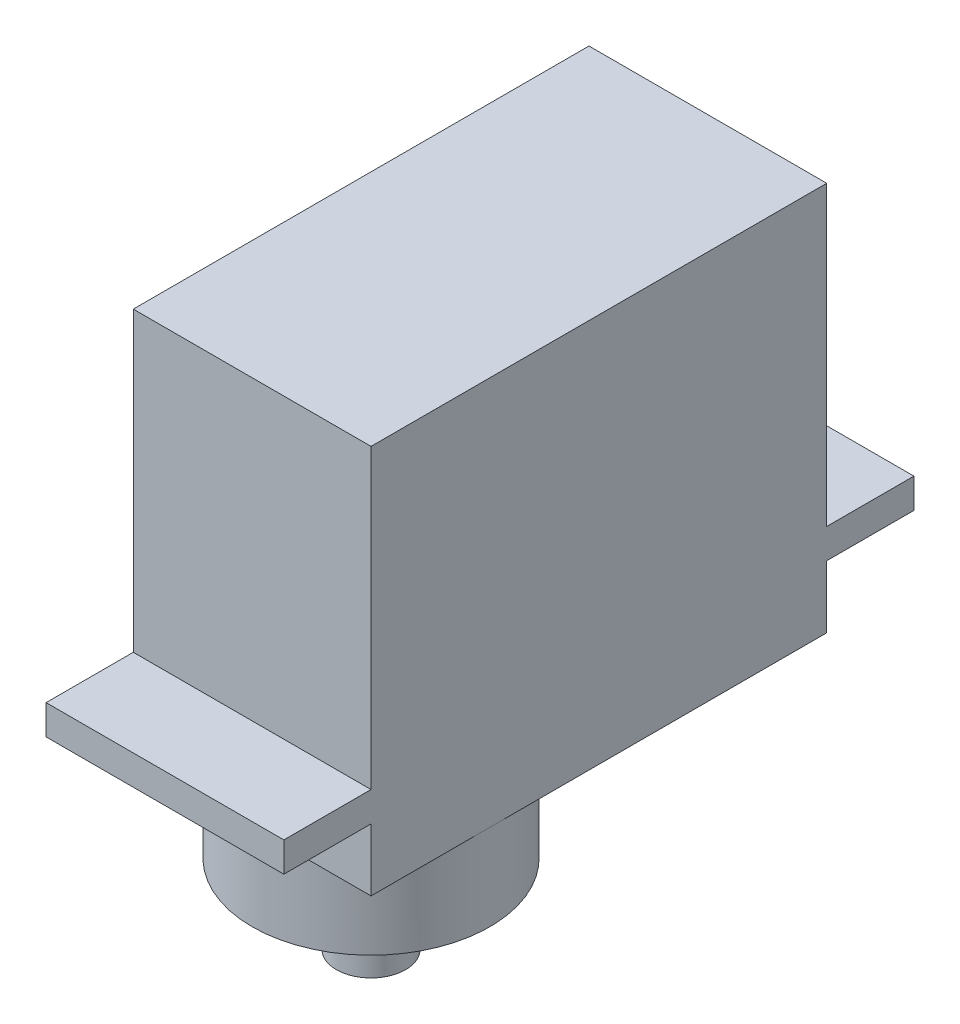
ISO-10303-21;
HEADER;
FILE_DESCRIPTION(('STEP AP214'),'2;1');
FILE_NAME('part.step','',(''),(''),'','','');
FILE_SCHEMA(('AUTOMOTIVE_DESIGN { 1 0 10303 214 1 1 1 1 }'));
ENDSEC;
DATA;
#1=APPLICATION_CONTEXT('core data for automotive mechanical design processes');
#2=APPLICATION_PROTOCOL_DEFINITION('international standard','automotive_design',2000,#1);
#3=PRODUCT_CONTEXT('',#1,'mechanical');
#4=PRODUCT('Part','Part','',(#3));
#5=PRODUCT_RELATED_PRODUCT_CATEGORY('part','',(#4));
#6=PRODUCT_DEFINITION_FORMATION('','',#4);
#7=PRODUCT_DEFINITION_CONTEXT('part definition',#1,'design');
#8=PRODUCT_DEFINITION('design','',#6,#7);
#9=PRODUCT_DEFINITION_SHAPE('','',#8);
#10=(LENGTH_UNIT() NAMED_UNIT(*) SI_UNIT(.MILLI.,.METRE.));
#11=(NAMED_UNIT(*) PLANE_ANGLE_UNIT() SI_UNIT($,.RADIAN.));
#12=(NAMED_UNIT(*) SI_UNIT($,.STERADIAN.) SOLID_ANGLE_UNIT());
#13=UNCERTAINTY_MEASURE_WITH_UNIT(LENGTH_MEASURE(1.E-05),#10,'distance_accuracy_value','');
#14=(GEOMETRIC_REPRESENTATION_CONTEXT(3) GLOBAL_UNCERTAINTY_ASSIGNED_CONTEXT((#13)) GLOBAL_UNIT_ASSIGNED_CONTEXT((#10,
#11,#12)) REPRESENTATION_CONTEXT('',''));
#15=CARTESIAN_POINT('',(0.,0.,0.));
#16=DIRECTION('',(0.,0.,1.));
#17=DIRECTION('',(1.,0.,0.));
#18=AXIS2_PLACEMENT_3D('',#15,#16,#17);
#19=CARTESIAN_POINT('',(12.,-4.65,-23.));
#20=DIRECTION('',(0.,1.,0.));
#21=DIRECTION('',(0.,0.,1.));
#22=AXIS2_PLACEMENT_3D('',#19,#20,#21);
#23=PLANE('',#22);
#24=CARTESIAN_POINT('',(6.,-4.65,-6.));
#25=DIRECTION('',(0.,-1.,0.));
#26=DIRECTION('',(0.,0.,-1.));
#27=AXIS2_PLACEMENT_3D('',#24,#25,#26);
#28=CIRCLE('',#27,6.);
#29=CARTESIAN_POINT('',(12.,-4.65,-6.));
#30=VERTEX_POINT('',#29);
#31=CARTESIAN_POINT('',(6.,-4.65,0.));
#32=VERTEX_POINT('',#31);
#33=EDGE_CURVE('E165',#30,#32,#28,.T.);
#34=ORIENTED_EDGE('',*,*,#33,.F.);
#35=DIRECTION('',(0.,0.,-1.));
#36=VECTOR('',#35,1.);
#37=CARTESIAN_POINT('',(12.,-4.65,-23.));
#38=LINE('',#37,#36);
#39=CARTESIAN_POINT('',(12.,-4.65,0.));
#40=VERTEX_POINT('',#39);
#41=EDGE_CURVE('E147',#40,#30,#38,.T.);
#42=ORIENTED_EDGE('',*,*,#41,.F.);
#43=DIRECTION('',(-1.,0.,0.));
#44=VECTOR('',#43,1.);
#45=CARTESIAN_POINT('',(12.,-4.65,0.));
#46=LINE('',#45,#44);
#47=EDGE_CURVE('E166',#40,#32,#46,.T.);
#48=ORIENTED_EDGE('',*,*,#47,.T.);
#49=EDGE_LOOP('',(#34,#42,#48));
#50=FACE_BOUND('',#49,.T.);
#51=ADVANCED_FACE('F47',(#50),#23,.F.);
#52=CARTESIAN_POINT('',(0.,-4.65,-6.));
#53=VERTEX_POINT('',#52);
#54=EDGE_CURVE('E56',#32,#53,#28,.T.);
#55=ORIENTED_EDGE('',*,*,#54,.F.);
#56=CARTESIAN_POINT('',(0.,-4.65,0.));
#57=VERTEX_POINT('',#56);
#58=EDGE_CURVE('E245',#32,#57,#46,.T.);
#59=ORIENTED_EDGE('',*,*,#58,.T.);
#60=DIRECTION('',(0.,0.,-1.));
#61=VECTOR('',#60,1.);
#62=CARTESIAN_POINT('',(0.,-4.65,-23.));
#63=LINE('',#62,#61);
#64=EDGE_CURVE('E209',#57,#53,#63,.T.);
#65=ORIENTED_EDGE('',*,*,#64,.T.);
#66=EDGE_LOOP('',(#55,#59,#65));
#67=FACE_BOUND('',#66,.T.);
#68=ADVANCED_FACE('F264',(#67),#23,.F.);
#69=CARTESIAN_POINT('',(12.,0.,4.4));
#70=DIRECTION('',(0.,-1.,0.));
#71=DIRECTION('',(0.,0.,-1.));
#72=AXIS2_PLACEMENT_3D('',#69,#70,#71);
#73=PLANE('',#72);
#74=DIRECTION('',(0.,0.,1.));
#75=VECTOR('',#74,1.);
#76=CARTESIAN_POINT('',(0.,0.,4.4));
#77=LINE('',#76,#75);
#78=CARTESIAN_POINT('',(0.,0.,0.));
#79=VERTEX_POINT('',#78);
#80=CARTESIAN_POINT('',(0.,0.,4.4));
#81=VERTEX_POINT('',#80);
#82=EDGE_CURVE('E198',#79,#81,#77,.T.);
#83=ORIENTED_EDGE('',*,*,#82,.T.);
#84=DIRECTION('',(-1.,0.,0.));
#85=VECTOR('',#84,1.);
#86=CARTESIAN_POINT('',(12.,0.,4.4));
#87=LINE('',#86,#85);
#88=CARTESIAN_POINT('',(12.,0.,4.4));
#89=VERTEX_POINT('',#88);
#90=EDGE_CURVE('E51',#89,#81,#87,.T.);
#91=ORIENTED_EDGE('',*,*,#90,.F.);
#92=DIRECTION('',(0.,0.,1.));
#93=VECTOR('',#92,1.);
#94=CARTESIAN_POINT('',(12.,0.,4.4));
#95=LINE('',#94,#93);
#96=CARTESIAN_POINT('',(12.,0.,0.));
#97=VERTEX_POINT('',#96);
#98=EDGE_CURVE('E176',#97,#89,#95,.T.);
#99=ORIENTED_EDGE('',*,*,#98,.F.);
#100=DIRECTION('',(-1.,0.,0.));
#101=VECTOR('',#100,1.);
#102=CARTESIAN_POINT('',(12.,0.,0.));
#103=LINE('',#102,#101);
#104=EDGE_CURVE('E197',#97,#79,#103,.T.);
#105=ORIENTED_EDGE('',*,*,#104,.T.);
#106=EDGE_LOOP('',(#83,#91,#99,#105));
#107=FACE_BOUND('',#106,.T.);
#108=ADVANCED_FACE('F49',(#107),#73,.F.);
#109=CARTESIAN_POINT('',(12.,-1.5,4.4));
#110=DIRECTION('',(0.,0.,-1.));
#111=DIRECTION('',(-1.,0.,0.));
#112=AXIS2_PLACEMENT_3D('',#109,#110,#111);
#113=PLANE('',#112);
#114=DIRECTION('',(0.,-1.,0.));
#115=VECTOR('',#114,1.);
#116=CARTESIAN_POINT('',(0.,-1.5,4.4));
#117=LINE('',#116,#115);
#118=CARTESIAN_POINT('',(0.,-1.5,4.4));
#119=VERTEX_POINT('',#118);
#120=EDGE_CURVE('E201',#81,#119,#117,.T.);
#121=ORIENTED_EDGE('',*,*,#120,.T.);
#122=DIRECTION('',(-1.,0.,0.));
#123=VECTOR('',#122,1.);
#124=CARTESIAN_POINT('',(12.,-1.5,4.4));
#125=LINE('',#124,#123);
#126=CARTESIAN_POINT('',(12.,-1.5,4.4));
#127=VERTEX_POINT('',#126);
#128=EDGE_CURVE('E173',#127,#119,#125,.T.);
#129=ORIENTED_EDGE('',*,*,#128,.F.);
#130=DIRECTION('',(0.,-1.,0.));
#131=VECTOR('',#130,1.);
#132=CARTESIAN_POINT('',(12.,-1.5,4.4));
#133=LINE('',#132,#131);
#134=EDGE_CURVE('E178',#89,#127,#133,.T.);
#135=ORIENTED_EDGE('',*,*,#134,.F.);
#136=ORIENTED_EDGE('',*,*,#90,.T.);
#137=EDGE_LOOP('',(#121,#129,#135,#136));
#138=FACE_BOUND('',#137,.T.);
#139=ADVANCED_FACE('F272',(#138),#113,.F.);
#140=CARTESIAN_POINT('',(12.,-1.5,0.));
#141=DIRECTION('',(0.,1.,0.));
#142=DIRECTION('',(0.,0.,1.));
#143=AXIS2_PLACEMENT_3D('',#140,#141,#142);
#144=PLANE('',#143);
#145=DIRECTION('',(0.,0.,-1.));
#146=VECTOR('',#145,1.);
#147=CARTESIAN_POINT('',(0.,-1.5,0.));
#148=LINE('',#147,#146);
#149=CARTESIAN_POINT('',(0.,-1.5,0.));
#150=VERTEX_POINT('',#149);
#151=EDGE_CURVE('E203',#119,#150,#148,.T.);
#152=ORIENTED_EDGE('',*,*,#151,.T.);
#153=DIRECTION('',(-1.,0.,0.));
#154=VECTOR('',#153,1.);
#155=CARTESIAN_POINT('',(12.,-1.5,0.));
#156=LINE('',#155,#154);
#157=CARTESIAN_POINT('',(12.,-1.5,0.));
#158=VERTEX_POINT('',#157);
#159=EDGE_CURVE('E247',#158,#150,#156,.T.);
#160=ORIENTED_EDGE('',*,*,#159,.F.);
#161=DIRECTION('',(0.,0.,-1.));
#162=VECTOR('',#161,1.);
#163=CARTESIAN_POINT('',(12.,-1.5,0.));
#164=LINE('',#163,#162);
#165=EDGE_CURVE('E181',#127,#158,#164,.T.);
#166=ORIENTED_EDGE('',*,*,#165,.F.);
#167=ORIENTED_EDGE('',*,*,#128,.T.);
#168=EDGE_LOOP('',(#152,#160,#166,#167));
#169=FACE_BOUND('',#168,.T.);
#170=ADVANCED_FACE('F254',(#169),#144,.F.);
#171=CARTESIAN_POINT('',(12.,-4.65,0.));
#172=DIRECTION('',(0.,0.,-1.));
#173=DIRECTION('',(0.,1.,0.));
#174=AXIS2_PLACEMENT_3D('',#171,#172,#173);
#175=PLANE('',#174);
#176=DIRECTION('',(0.,-1.,0.));
#177=VECTOR('',#176,1.);
#178=CARTESIAN_POINT('',(0.,-4.65,0.));
#179=LINE('',#178,#177);
#180=EDGE_CURVE('E205',#150,#57,#179,.T.);
#181=ORIENTED_EDGE('',*,*,#180,.T.);
#182=ORIENTED_EDGE('',*,*,#58,.F.);
#183=ORIENTED_EDGE('',*,*,#47,.F.);
#184=DIRECTION('',(0.,-1.,0.));
#185=VECTOR('',#184,1.);
#186=CARTESIAN_POINT('',(12.,-4.65,0.));
#187=LINE('',#186,#185);
#188=EDGE_CURVE('E153',#158,#40,#187,.T.);
#189=ORIENTED_EDGE('',*,*,#188,.F.);
#190=ORIENTED_EDGE('',*,*,#159,.T.);
#191=EDGE_LOOP('',(#181,#182,#183,#189,#190));
#192=FACE_BOUND('',#191,.T.);
#193=ADVANCED_FACE('F263',(#192),#175,.F.);
#194=EDGE_CURVE('E71',#53,#30,#28,.T.);
#195=ORIENTED_EDGE('',*,*,#194,.F.);
#196=CARTESIAN_POINT('',(0.,-4.65,-23.));
#197=VERTEX_POINT('',#196);
#198=EDGE_CURVE('E208',#53,#197,#63,.T.);
#199=ORIENTED_EDGE('',*,*,#198,.T.);
#200=DIRECTION('',(-1.,0.,0.));
#201=VECTOR('',#200,1.);
#202=CARTESIAN_POINT('',(12.,-4.65,-23.));
#203=LINE('',#202,#201);
#204=CARTESIAN_POINT('',(12.,-4.65,-23.));
#205=VERTEX_POINT('',#204);
#206=EDGE_CURVE('E162',#205,#197,#203,.T.);
#207=ORIENTED_EDGE('',*,*,#206,.F.);
#208=EDGE_CURVE('E150',#30,#205,#38,.T.);
#209=ORIENTED_EDGE('',*,*,#208,.F.);
#210=EDGE_LOOP('',(#195,#199,#207,#209));
#211=FACE_BOUND('',#210,.T.);
#212=ADVANCED_FACE('F160',(#211),#23,.F.);
#213=CARTESIAN_POINT('',(12.,-1.49999999999999,-23.));
#214=DIRECTION('',(0.,0.,1.));
#215=DIRECTION('',(0.,-1.,0.));
#216=AXIS2_PLACEMENT_3D('',#213,#214,#215);
#217=PLANE('',#216);
#218=DIRECTION('',(0.,1.,0.));
#219=VECTOR('',#218,1.);
#220=CARTESIAN_POINT('',(0.,-1.49999999999999,-23.));
#221=LINE('',#220,#219);
#222=CARTESIAN_POINT('',(0.,-1.49999999999999,-23.));
#223=VERTEX_POINT('',#222);
#224=EDGE_CURVE('E211',#197,#223,#221,.T.);
#225=ORIENTED_EDGE('',*,*,#224,.T.);
#226=DIRECTION('',(-1.,0.,0.));
#227=VECTOR('',#226,1.);
#228=CARTESIAN_POINT('',(12.,-1.49999999999999,-23.));
#229=LINE('',#228,#227);
#230=CARTESIAN_POINT('',(12.,-1.49999999999999,-23.));
#231=VERTEX_POINT('',#230);
#232=EDGE_CURVE('E241',#231,#223,#229,.T.);
#233=ORIENTED_EDGE('',*,*,#232,.F.);
#234=DIRECTION('',(0.,1.,0.));
#235=VECTOR('',#234,1.);
#236=CARTESIAN_POINT('',(12.,-1.49999999999999,-23.));
#237=LINE('',#236,#235);
#238=EDGE_CURVE('E158',#205,#231,#237,.T.);
#239=ORIENTED_EDGE('',*,*,#238,.F.);
#240=ORIENTED_EDGE('',*,*,#206,.T.);
#241=EDGE_LOOP('',(#225,#233,#239,#240));
#242=FACE_BOUND('',#241,.T.);
#243=ADVANCED_FACE('F277',(#242),#217,.F.);
#244=CARTESIAN_POINT('',(12.,-1.49999999999999,-27.4));
#245=DIRECTION('',(0.,1.,0.));
#246=DIRECTION('',(0.,0.,1.));
#247=AXIS2_PLACEMENT_3D('',#244,#245,#246);
#248=PLANE('',#247);
#249=DIRECTION('',(0.,0.,-1.));
#250=VECTOR('',#249,1.);
#251=CARTESIAN_POINT('',(0.,-1.49999999999999,-27.4));
#252=LINE('',#251,#250);
#253=CARTESIAN_POINT('',(0.,-1.49999999999999,-27.4));
#254=VERTEX_POINT('',#253);
#255=EDGE_CURVE('E213',#223,#254,#252,.T.);
#256=ORIENTED_EDGE('',*,*,#255,.T.);
#257=DIRECTION('',(-1.,0.,0.));
#258=VECTOR('',#257,1.);
#259=CARTESIAN_POINT('',(12.,-1.49999999999999,-27.4));
#260=LINE('',#259,#258);
#261=CARTESIAN_POINT('',(12.,-1.49999999999999,-27.4));
#262=VERTEX_POINT('',#261);
#263=EDGE_CURVE('E238',#262,#254,#260,.T.);
#264=ORIENTED_EDGE('',*,*,#263,.F.);
#265=DIRECTION('',(0.,0.,-1.));
#266=VECTOR('',#265,1.);
#267=CARTESIAN_POINT('',(12.,-1.49999999999999,-27.4));
#268=LINE('',#267,#266);
#269=EDGE_CURVE('E185',#231,#262,#268,.T.);
#270=ORIENTED_EDGE('',*,*,#269,.F.);
#271=ORIENTED_EDGE('',*,*,#232,.T.);
#272=EDGE_LOOP('',(#256,#264,#270,#271));
#273=FACE_BOUND('',#272,.T.);
#274=ADVANCED_FACE('F282',(#273),#248,.F.);
#275=CARTESIAN_POINT('',(12.,0.,-27.4));
#276=DIRECTION('',(0.,0.,1.));
#277=DIRECTION('',(0.,-1.,0.));
#278=AXIS2_PLACEMENT_3D('',#275,#276,#277);
#279=PLANE('',#278);
#280=DIRECTION('',(0.,1.,0.));
#281=VECTOR('',#280,1.);
#282=CARTESIAN_POINT('',(0.,0.,-27.4));
#283=LINE('',#282,#281);
#284=CARTESIAN_POINT('',(0.,0.,-27.4));
#285=VERTEX_POINT('',#284);
#286=EDGE_CURVE('E215',#254,#285,#283,.T.);
#287=ORIENTED_EDGE('',*,*,#286,.T.);
#288=DIRECTION('',(-1.,0.,0.));
#289=VECTOR('',#288,1.);
#290=CARTESIAN_POINT('',(12.,0.,-27.4));
#291=LINE('',#290,#289);
#292=CARTESIAN_POINT('',(12.,0.,-27.4));
#293=VERTEX_POINT('',#292);
#294=EDGE_CURVE('E235',#293,#285,#291,.T.);
#295=ORIENTED_EDGE('',*,*,#294,.F.);
#296=DIRECTION('',(0.,1.,0.));
#297=VECTOR('',#296,1.);
#298=CARTESIAN_POINT('',(12.,0.,-27.4));
#299=LINE('',#298,#297);
#300=EDGE_CURVE('E187',#262,#293,#299,.T.);
#301=ORIENTED_EDGE('',*,*,#300,.F.);
#302=ORIENTED_EDGE('',*,*,#263,.T.);
#303=EDGE_LOOP('',(#287,#295,#301,#302));
#304=FACE_BOUND('',#303,.T.);
#305=ADVANCED_FACE('F318',(#304),#279,.F.);
#306=CARTESIAN_POINT('',(12.,0.,-23.));
#307=DIRECTION('',(0.,-1.,0.));
#308=DIRECTION('',(0.,0.,-1.));
#309=AXIS2_PLACEMENT_3D('',#306,#307,#308);
#310=PLANE('',#309);
#311=DIRECTION('',(0.,0.,1.));
#312=VECTOR('',#311,1.);
#313=CARTESIAN_POINT('',(0.,0.,-23.));
#314=LINE('',#313,#312);
#315=CARTESIAN_POINT('',(0.,0.,-23.));
#316=VERTEX_POINT('',#315);
#317=EDGE_CURVE('E217',#285,#316,#314,.T.);
#318=ORIENTED_EDGE('',*,*,#317,.T.);
#319=DIRECTION('',(-1.,0.,0.));
#320=VECTOR('',#319,1.);
#321=CARTESIAN_POINT('',(12.,0.,-23.));
#322=LINE('',#321,#320);
#323=CARTESIAN_POINT('',(12.,0.,-23.));
#324=VERTEX_POINT('',#323);
#325=EDGE_CURVE('E232',#324,#316,#322,.T.);
#326=ORIENTED_EDGE('',*,*,#325,.F.);
#327=DIRECTION('',(0.,0.,1.));
#328=VECTOR('',#327,1.);
#329=CARTESIAN_POINT('',(12.,0.,-23.));
#330=LINE('',#329,#328);
#331=EDGE_CURVE('E189',#293,#324,#330,.T.);
#332=ORIENTED_EDGE('',*,*,#331,.F.);
#333=ORIENTED_EDGE('',*,*,#294,.T.);
#334=EDGE_LOOP('',(#318,#326,#332,#333));
#335=FACE_BOUND('',#334,.T.);
#336=ADVANCED_FACE('F313',(#335),#310,.F.);
#337=CARTESIAN_POINT('',(12.,15.,-23.));
#338=DIRECTION('',(0.,0.,1.));
#339=DIRECTION('',(1.,0.,0.));
#340=AXIS2_PLACEMENT_3D('',#337,#338,#339);
#341=PLANE('',#340);
#342=DIRECTION('',(0.,1.,0.));
#343=VECTOR('',#342,1.);
#344=CARTESIAN_POINT('',(0.,15.,-23.));
#345=LINE('',#344,#343);
#346=CARTESIAN_POINT('',(0.,15.,-23.));
#347=VERTEX_POINT('',#346);
#348=EDGE_CURVE('E219',#316,#347,#345,.T.);
#349=ORIENTED_EDGE('',*,*,#348,.T.);
#350=DIRECTION('',(-1.,0.,0.));
#351=VECTOR('',#350,1.);
#352=CARTESIAN_POINT('',(12.,15.,-23.));
#353=LINE('',#352,#351);
#354=CARTESIAN_POINT('',(12.,15.,-23.));
#355=VERTEX_POINT('',#354);
#356=EDGE_CURVE('E229',#355,#347,#353,.T.);
#357=ORIENTED_EDGE('',*,*,#356,.F.);
#358=DIRECTION('',(0.,1.,0.));
#359=VECTOR('',#358,1.);
#360=CARTESIAN_POINT('',(12.,15.,-23.));
#361=LINE('',#360,#359);
#362=EDGE_CURVE('E191',#324,#355,#361,.T.);
#363=ORIENTED_EDGE('',*,*,#362,.F.);
#364=ORIENTED_EDGE('',*,*,#325,.T.);
#365=EDGE_LOOP('',(#349,#357,#363,#364));
#366=FACE_BOUND('',#365,.T.);
#367=ADVANCED_FACE('F307',(#366),#341,.F.);
#368=CARTESIAN_POINT('',(12.,15.,0.));
#369=DIRECTION('',(0.,-1.,0.));
#370=DIRECTION('',(0.,0.,-1.));
#371=AXIS2_PLACEMENT_3D('',#368,#369,#370);
#372=PLANE('',#371);
#373=DIRECTION('',(0.,0.,1.));
#374=VECTOR('',#373,1.);
#375=CARTESIAN_POINT('',(0.,15.,0.));
#376=LINE('',#375,#374);
#377=CARTESIAN_POINT('',(0.,15.,0.));
#378=VERTEX_POINT('',#377);
#379=EDGE_CURVE('E221',#347,#378,#376,.T.);
#380=ORIENTED_EDGE('',*,*,#379,.T.);
#381=DIRECTION('',(-1.,0.,0.));
#382=VECTOR('',#381,1.);
#383=CARTESIAN_POINT('',(12.,15.,0.));
#384=LINE('',#383,#382);
#385=CARTESIAN_POINT('',(12.,15.,0.));
#386=VERTEX_POINT('',#385);
#387=EDGE_CURVE('E226',#386,#378,#384,.T.);
#388=ORIENTED_EDGE('',*,*,#387,.F.);
#389=DIRECTION('',(0.,0.,1.));
#390=VECTOR('',#389,1.);
#391=CARTESIAN_POINT('',(12.,15.,0.));
#392=LINE('',#391,#390);
#393=EDGE_CURVE('E193',#355,#386,#392,.T.);
#394=ORIENTED_EDGE('',*,*,#393,.F.);
#395=ORIENTED_EDGE('',*,*,#356,.T.);
#396=EDGE_LOOP('',(#380,#388,#394,#395));
#397=FACE_BOUND('',#396,.T.);
#398=ADVANCED_FACE('F303',(#397),#372,.F.);
#399=CARTESIAN_POINT('',(12.,0.,0.));
#400=DIRECTION('',(0.,0.,-1.));
#401=DIRECTION('',(-1.,0.,0.));
#402=AXIS2_PLACEMENT_3D('',#399,#400,#401);
#403=PLANE('',#402);
#404=DIRECTION('',(0.,-1.,0.));
#405=VECTOR('',#404,1.);
#406=CARTESIAN_POINT('',(0.,0.,0.));
#407=LINE('',#406,#405);
#408=EDGE_CURVE('E179',#378,#79,#407,.T.);
#409=ORIENTED_EDGE('',*,*,#408,.T.);
#410=ORIENTED_EDGE('',*,*,#104,.F.);
#411=DIRECTION('',(0.,-1.,0.));
#412=VECTOR('',#411,1.);
#413=CARTESIAN_POINT('',(12.,0.,0.));
#414=LINE('',#413,#412);
#415=EDGE_CURVE('E195',#386,#97,#414,.T.);
#416=ORIENTED_EDGE('',*,*,#415,.F.);
#417=ORIENTED_EDGE('',*,*,#387,.T.);
#418=EDGE_LOOP('',(#409,#410,#416,#417));
#419=FACE_BOUND('',#418,.T.);
#420=ADVANCED_FACE('F298',(#419),#403,.F.);
#421=CARTESIAN_POINT('',(12.,0.,0.));
#422=DIRECTION('',(1.,0.,0.));
#423=DIRECTION('',(0.,0.,-1.));
#424=AXIS2_PLACEMENT_3D('',#421,#422,#423);
#425=PLANE('',#424);
#426=ORIENTED_EDGE('',*,*,#98,.T.);
#427=ORIENTED_EDGE('',*,*,#134,.T.);
#428=ORIENTED_EDGE('',*,*,#165,.T.);
#429=ORIENTED_EDGE('',*,*,#188,.T.);
#430=ORIENTED_EDGE('',*,*,#41,.T.);
#431=ORIENTED_EDGE('',*,*,#208,.T.);
#432=ORIENTED_EDGE('',*,*,#238,.T.);
#433=ORIENTED_EDGE('',*,*,#269,.T.);
#434=ORIENTED_EDGE('',*,*,#300,.T.);
#435=ORIENTED_EDGE('',*,*,#331,.T.);
#436=ORIENTED_EDGE('',*,*,#362,.T.);
#437=ORIENTED_EDGE('',*,*,#393,.T.);
#438=ORIENTED_EDGE('',*,*,#415,.T.);
#439=EDGE_LOOP('',(#426,#427,#428,#429,#430,#431,#432,#433,#434,#435,#436,#437,#438));
#440=FACE_BOUND('',#439,.T.);
#441=ADVANCED_FACE('F149',(#440),#425,.T.);
#442=CARTESIAN_POINT('',(0.,0.,0.));
#443=DIRECTION('',(1.,0.,0.));
#444=DIRECTION('',(0.,0.,-1.));
#445=AXIS2_PLACEMENT_3D('',#442,#443,#444);
#446=PLANE('',#445);
#447=ORIENTED_EDGE('',*,*,#82,.F.);
#448=ORIENTED_EDGE('',*,*,#408,.F.);
#449=ORIENTED_EDGE('',*,*,#379,.F.);
#450=ORIENTED_EDGE('',*,*,#348,.F.);
#451=ORIENTED_EDGE('',*,*,#317,.F.);
#452=ORIENTED_EDGE('',*,*,#286,.F.);
#453=ORIENTED_EDGE('',*,*,#255,.F.);
#454=ORIENTED_EDGE('',*,*,#224,.F.);
#455=ORIENTED_EDGE('',*,*,#198,.F.);
#456=ORIENTED_EDGE('',*,*,#64,.F.);
#457=ORIENTED_EDGE('',*,*,#180,.F.);
#458=ORIENTED_EDGE('',*,*,#151,.F.);
#459=ORIENTED_EDGE('',*,*,#120,.F.);
#460=EDGE_LOOP('',(#447,#448,#449,#450,#451,#452,#453,#454,#455,#456,#457,#458,#459));
#461=FACE_BOUND('',#460,.T.);
#462=ADVANCED_FACE('F260',(#461),#446,.F.);
#463=CARTESIAN_POINT('',(6.,-9.,-6.));
#464=DIRECTION('',(0.,1.,0.));
#465=DIRECTION('',(0.,0.,1.));
#466=AXIS2_PLACEMENT_3D('',#463,#464,#465);
#467=CYLINDRICAL_SURFACE('',#466,6.);
#468=CARTESIAN_POINT('',(6.,-9.,-6.));
#469=DIRECTION('',(0.,-1.,0.));
#470=DIRECTION('',(0.,0.,-1.));
#471=AXIS2_PLACEMENT_3D('',#468,#469,#470);
#472=CIRCLE('',#471,6.);
#473=CARTESIAN_POINT('',(6.,-9.,-12.));
#474=VERTEX_POINT('',#473);
#475=EDGE_CURVE('E168',#474,#474,#472,.T.);
#476=ORIENTED_EDGE('',*,*,#475,.F.);
#477=EDGE_LOOP('',(#476));
#478=FACE_BOUND('',#477,.T.);
#479=ORIENTED_EDGE('',*,*,#33,.T.);
#480=ORIENTED_EDGE('',*,*,#54,.T.);
#481=ORIENTED_EDGE('',*,*,#194,.T.);
#482=EDGE_LOOP('',(#479,#480,#481));
#483=FACE_BOUND('',#482,.T.);
#484=ADVANCED_FACE('F171',(#478,#483),#467,.T.);
#485=CARTESIAN_POINT('',(6.,-9.,-6.));
#486=DIRECTION('',(0.,-1.,0.));
#487=DIRECTION('',(0.,0.,-1.));
#488=AXIS2_PLACEMENT_3D('',#485,#486,#487);
#489=PLANE('',#488);
#490=CARTESIAN_POINT('',(6.,-9.,-6.));
#491=DIRECTION('',(0.,-1.,0.));
#492=DIRECTION('',(0.,0.,-1.));
#493=AXIS2_PLACEMENT_3D('',#490,#491,#492);
#494=CIRCLE('',#493,1.75);
#495=CARTESIAN_POINT('',(6.,-9.,-7.75));
#496=VERTEX_POINT('',#495);
#497=EDGE_CURVE('E11',#496,#496,#494,.T.);
#498=ORIENTED_EDGE('',*,*,#497,.F.);
#499=EDGE_LOOP('',(#498));
#500=FACE_BOUND('',#499,.T.);
#501=ORIENTED_EDGE('',*,*,#475,.T.);
#502=EDGE_LOOP('',(#501));
#503=FACE_BOUND('',#502,.T.);
#504=ADVANCED_FACE('F344',(#500,#503),#489,.T.);
#505=CARTESIAN_POINT('',(6.,-13.,-6.));
#506=DIRECTION('',(0.,1.,0.));
#507=DIRECTION('',(0.,0.,1.));
#508=AXIS2_PLACEMENT_3D('',#505,#506,#507);
#509=CYLINDRICAL_SURFACE('',#508,1.75);
#510=CARTESIAN_POINT('',(6.,-13.,-6.));
#511=DIRECTION('',(0.,-1.,0.));
#512=DIRECTION('',(0.,0.,-1.));
#513=AXIS2_PLACEMENT_3D('',#510,#511,#512);
#514=CIRCLE('',#513,1.75);
#515=CARTESIAN_POINT('',(6.,-13.,-7.75));
#516=VERTEX_POINT('',#515);
#517=EDGE_CURVE('E169',#516,#516,#514,.T.);
#518=ORIENTED_EDGE('',*,*,#517,.F.);
#519=EDGE_LOOP('',(#518));
#520=FACE_BOUND('',#519,.T.);
#521=ORIENTED_EDGE('',*,*,#497,.T.);
#522=EDGE_LOOP('',(#521));
#523=FACE_BOUND('',#522,.T.);
#524=ADVANCED_FACE('F348',(#520,#523),#509,.T.);
#525=CARTESIAN_POINT('',(6.,-13.,-6.));
#526=DIRECTION('',(0.,-1.,0.));
#527=DIRECTION('',(0.,0.,-1.));
#528=AXIS2_PLACEMENT_3D('',#525,#526,#527);
#529=PLANE('',#528);
#530=ORIENTED_EDGE('',*,*,#517,.T.);
#531=EDGE_LOOP('',(#530));
#532=FACE_BOUND('',#531,.T.);
#533=ADVANCED_FACE('F352',(#532),#529,.T.);
#534=CLOSED_SHELL('',(#51,#68,#108,#139,#170,#193,#212,#243,#274,#305,#336,#367,#398,#420,#441,
#462,#484,#504,#524,#533));
#535=MANIFOLD_SOLID_BREP('B2',#534);
#536=ADVANCED_BREP_SHAPE_REPRESENTATION('',(#18,#535),#14);
#537=SHAPE_DEFINITION_REPRESENTATION(#9,#536);
ENDSEC;
END-ISO-10303-21;
